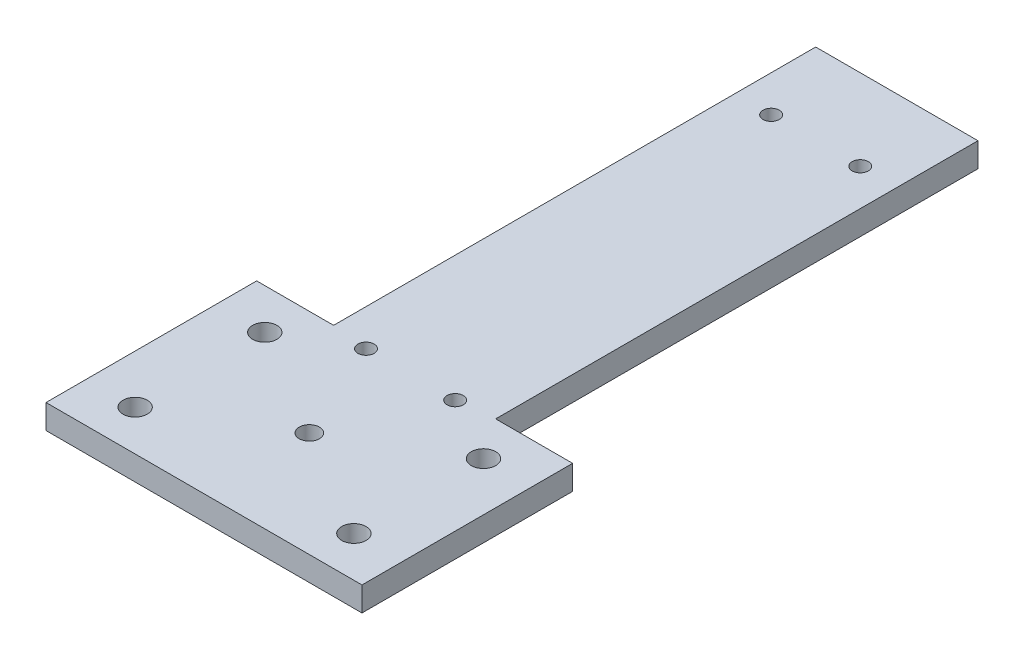
ISO-10303-21;
HEADER;
FILE_DESCRIPTION(('STEP AP214'),'2;1');
FILE_NAME('part.step','',(''),(''),'','','');
FILE_SCHEMA(('AUTOMOTIVE_DESIGN { 1 0 10303 214 1 1 1 1 }'));
ENDSEC;
DATA;
#1=APPLICATION_CONTEXT('core data for automotive mechanical design processes');
#2=APPLICATION_PROTOCOL_DEFINITION('international standard','automotive_design',2000,#1);
#3=PRODUCT_CONTEXT('',#1,'mechanical');
#4=PRODUCT('Part','Part','',(#3));
#5=PRODUCT_RELATED_PRODUCT_CATEGORY('part','',(#4));
#6=PRODUCT_DEFINITION_FORMATION('','',#4);
#7=PRODUCT_DEFINITION_CONTEXT('part definition',#1,'design');
#8=PRODUCT_DEFINITION('design','',#6,#7);
#9=PRODUCT_DEFINITION_SHAPE('','',#8);
#10=(LENGTH_UNIT() NAMED_UNIT(*) SI_UNIT(.MILLI.,.METRE.));
#11=(NAMED_UNIT(*) PLANE_ANGLE_UNIT() SI_UNIT($,.RADIAN.));
#12=(NAMED_UNIT(*) SI_UNIT($,.STERADIAN.) SOLID_ANGLE_UNIT());
#13=UNCERTAINTY_MEASURE_WITH_UNIT(LENGTH_MEASURE(1.E-05),#10,'distance_accuracy_value','');
#14=(GEOMETRIC_REPRESENTATION_CONTEXT(3) GLOBAL_UNCERTAINTY_ASSIGNED_CONTEXT((#13)) GLOBAL_UNIT_ASSIGNED_CONTEXT((#10,
#11,#12)) REPRESENTATION_CONTEXT('',''));
#15=CARTESIAN_POINT('',(0.,0.,0.));
#16=DIRECTION('',(0.,0.,1.));
#17=DIRECTION('',(1.,0.,0.));
#18=AXIS2_PLACEMENT_3D('',#15,#16,#17);
#19=CARTESIAN_POINT('',(0.000868295389407797,1186.43618290483,1920.91142558986));
#20=DIRECTION('',(-4.52022606479462E-07,0.,-0.999999999999898));
#21=DIRECTION('',(-0.999999999999898,0.,4.52022606479462E-07));
#22=AXIS2_PLACEMENT_3D('',#19,#20,#21);
#23=PLANE('',#22);
#24=DIRECTION('',(0.999999999999898,0.,-4.52022606479462E-07));
#25=VECTOR('',#24,1.);
#26=CARTESIAN_POINT('',(0.000868295389411396,1180.43618290483,1920.91142558986));
#27=LINE('',#26,#25);
#28=CARTESIAN_POINT('',(831.275007126595,1180.43618290483,1920.91104983515));
#29=VERTEX_POINT('',#28);
#30=CARTESIAN_POINT('',(850.275007126605,1180.43618290483,1920.91104124673));
#31=VERTEX_POINT('',#30);
#32=EDGE_CURVE('E155',#29,#31,#27,.T.);
#33=ORIENTED_EDGE('',*,*,#32,.F.);
#34=DIRECTION('',(0.,-1.,0.));
#35=VECTOR('',#34,1.);
#36=CARTESIAN_POINT('',(831.275007126595,1186.43618290483,1920.91104983515));
#37=LINE('',#36,#35);
#38=CARTESIAN_POINT('',(831.275007126595,1186.43618290483,1920.91104983515));
#39=VERTEX_POINT('',#38);
#40=EDGE_CURVE('E11',#39,#29,#37,.T.);
#41=ORIENTED_EDGE('',*,*,#40,.F.);
#42=DIRECTION('',(0.999999999999898,0.,-4.52022606479462E-07));
#43=VECTOR('',#42,1.);
#44=CARTESIAN_POINT('',(0.000868295389407797,1186.43618290483,1920.91142558986));
#45=LINE('',#44,#43);
#46=CARTESIAN_POINT('',(850.275007126605,1186.43618290483,1920.91104124673));
#47=VERTEX_POINT('',#46);
#48=EDGE_CURVE('E423',#39,#47,#45,.T.);
#49=ORIENTED_EDGE('',*,*,#48,.T.);
#50=DIRECTION('',(0.,-1.,0.));
#51=VECTOR('',#50,1.);
#52=CARTESIAN_POINT('',(850.275007126605,1186.43618290483,1920.91104124673));
#53=LINE('',#52,#51);
#54=EDGE_CURVE('E58',#47,#31,#53,.T.);
#55=ORIENTED_EDGE('',*,*,#54,.T.);
#56=EDGE_LOOP('',(#33,#41,#49,#55));
#57=FACE_BOUND('',#56,.T.);
#58=ADVANCED_FACE('F41',(#57),#23,.T.);
#59=CARTESIAN_POINT('',(832.333663807548,1186.43618290483,0.458827136420092));
#60=DIRECTION('',(-0.999999848059631,0.,-0.000551253765955834));
#61=DIRECTION('',(-0.000551253765955834,0.,0.999999848059631));
#62=AXIS2_PLACEMENT_3D('',#59,#60,#61);
#63=PLANE('',#62);
#64=DIRECTION('',(0.000551253765955834,0.,-0.999999848059631));
#65=VECTOR('',#64,1.);
#66=CARTESIAN_POINT('',(832.333663807548,1180.43618290483,0.458827136420092));
#67=LINE('',#66,#65);
#68=CARTESIAN_POINT('',(831.340606324744,1180.43618290483,1801.91106791605));
#69=VERTEX_POINT('',#68);
#70=EDGE_CURVE('E152',#29,#69,#67,.T.);
#71=ORIENTED_EDGE('',*,*,#70,.T.);
#72=DIRECTION('',(0.,-1.,0.));
#73=VECTOR('',#72,1.);
#74=CARTESIAN_POINT('',(831.340606324744,1186.43618290483,1801.91106791605));
#75=LINE('',#74,#73);
#76=CARTESIAN_POINT('',(831.340606324744,1186.43618290483,1801.91106791605));
#77=VERTEX_POINT('',#76);
#78=EDGE_CURVE('E50',#77,#69,#75,.T.);
#79=ORIENTED_EDGE('',*,*,#78,.F.);
#80=DIRECTION('',(0.000551253765955834,0.,-0.999999848059631));
#81=VECTOR('',#80,1.);
#82=CARTESIAN_POINT('',(832.333663807548,1186.43618290483,0.458827136420092));
#83=LINE('',#82,#81);
#84=EDGE_CURVE('E424',#39,#77,#83,.T.);
#85=ORIENTED_EDGE('',*,*,#84,.F.);
#86=ORIENTED_EDGE('',*,*,#40,.T.);
#87=EDGE_LOOP('',(#71,#79,#85,#86));
#88=FACE_BOUND('',#87,.T.);
#89=ADVANCED_FACE('F153',(#88),#63,.F.);
#90=CARTESIAN_POINT('',(9.98263917371704E-12,1186.43618290483,1801.91106791606));
#91=DIRECTION('',(0.,0.,-1.));
#92=DIRECTION('',(-1.,0.,0.));
#93=AXIS2_PLACEMENT_3D('',#90,#91,#92);
#94=PLANE('',#93);
#95=DIRECTION('',(1.,0.,0.));
#96=VECTOR('',#95,1.);
#97=CARTESIAN_POINT('',(9.9862385486062E-12,1180.43618290483,1801.91106791606));
#98=LINE('',#97,#96);
#99=CARTESIAN_POINT('',(791.275007126604,1180.43618290483,1801.91106791605));
#100=VERTEX_POINT('',#99);
#101=EDGE_CURVE('E147',#100,#69,#98,.T.);
#102=ORIENTED_EDGE('',*,*,#101,.F.);
#103=DIRECTION('',(0.,-1.,0.));
#104=VECTOR('',#103,1.);
#105=CARTESIAN_POINT('',(791.275007126604,1186.43618290483,1801.91106791605));
#106=LINE('',#105,#104);
#107=CARTESIAN_POINT('',(791.275007126604,1186.43618290483,1801.91106791605));
#108=VERTEX_POINT('',#107);
#109=EDGE_CURVE('E139',#108,#100,#106,.T.);
#110=ORIENTED_EDGE('',*,*,#109,.F.);
#111=DIRECTION('',(1.,0.,0.));
#112=VECTOR('',#111,1.);
#113=CARTESIAN_POINT('',(9.98263917371704E-12,1186.43618290483,1801.91106791606));
#114=LINE('',#113,#112);
#115=EDGE_CURVE('E149',#108,#77,#114,.T.);
#116=ORIENTED_EDGE('',*,*,#115,.T.);
#117=ORIENTED_EDGE('',*,*,#78,.T.);
#118=EDGE_LOOP('',(#102,#110,#116,#117));
#119=FACE_BOUND('',#118,.T.);
#120=ADVANCED_FACE('F145',(#119),#94,.T.);
#121=CARTESIAN_POINT('',(791.275007126606,1186.43618290483,7.3822834598517E-13));
#122=DIRECTION('',(1.,0.,0.));
#123=DIRECTION('',(0.,0.,-1.));
#124=AXIS2_PLACEMENT_3D('',#121,#122,#123);
#125=PLANE('',#124);
#126=DIRECTION('',(0.,0.,1.));
#127=VECTOR('',#126,1.);
#128=CARTESIAN_POINT('',(791.275007126606,1180.43618290483,7.3822834598517E-13));
#129=LINE('',#128,#127);
#130=CARTESIAN_POINT('',(791.275007126604,1180.43618290483,1920.91106791606));
#131=VERTEX_POINT('',#130);
#132=EDGE_CURVE('E162',#100,#131,#129,.T.);
#133=ORIENTED_EDGE('',*,*,#132,.T.);
#134=DIRECTION('',(0.,-1.,0.));
#135=VECTOR('',#134,1.);
#136=CARTESIAN_POINT('',(791.275007126604,1186.43618290483,1920.91106791606));
#137=LINE('',#136,#135);
#138=CARTESIAN_POINT('',(791.275007126604,1186.43618290483,1920.91106791606));
#139=VERTEX_POINT('',#138);
#140=EDGE_CURVE('E133',#139,#131,#137,.T.);
#141=ORIENTED_EDGE('',*,*,#140,.F.);
#142=DIRECTION('',(0.,0.,1.));
#143=VECTOR('',#142,1.);
#144=CARTESIAN_POINT('',(791.275007126606,1186.43618290483,7.3822834598517E-13));
#145=LINE('',#144,#143);
#146=EDGE_CURVE('E419',#108,#139,#145,.T.);
#147=ORIENTED_EDGE('',*,*,#146,.F.);
#148=ORIENTED_EDGE('',*,*,#109,.T.);
#149=EDGE_LOOP('',(#133,#141,#147,#148));
#150=FACE_BOUND('',#149,.T.);
#151=ADVANCED_FACE('F380',(#150),#125,.F.);
#152=CARTESIAN_POINT('',(0.,1186.43618290483,1920.91106791606));
#153=DIRECTION('',(0.,0.,-1.));
#154=DIRECTION('',(0.,1.,0.));
#155=AXIS2_PLACEMENT_3D('',#152,#153,#154);
#156=PLANE('',#155);
#157=DIRECTION('',(1.,0.,0.));
#158=VECTOR('',#157,1.);
#159=CARTESIAN_POINT('',(0.,1180.43618290483,1920.91106791606));
#160=LINE('',#159,#158);
#161=CARTESIAN_POINT('',(772.275007126593,1180.43618290483,1920.91106791606));
#162=VERTEX_POINT('',#161);
#163=EDGE_CURVE('E164',#162,#131,#160,.T.);
#164=ORIENTED_EDGE('',*,*,#163,.F.);
#165=DIRECTION('',(0.,-1.,0.));
#166=VECTOR('',#165,1.);
#167=CARTESIAN_POINT('',(772.275007126593,1186.43618290483,1920.91106791606));
#168=LINE('',#167,#166);
#169=CARTESIAN_POINT('',(772.275007126593,1186.43618290483,1920.91106791606));
#170=VERTEX_POINT('',#169);
#171=EDGE_CURVE('E131',#170,#162,#168,.T.);
#172=ORIENTED_EDGE('',*,*,#171,.F.);
#173=DIRECTION('',(1.,0.,0.));
#174=VECTOR('',#173,1.);
#175=CARTESIAN_POINT('',(0.,1186.43618290483,1920.91106791606));
#176=LINE('',#175,#174);
#177=EDGE_CURVE('E125',#170,#139,#176,.T.);
#178=ORIENTED_EDGE('',*,*,#177,.T.);
#179=ORIENTED_EDGE('',*,*,#140,.T.);
#180=EDGE_LOOP('',(#164,#172,#178,#179));
#181=FACE_BOUND('',#180,.T.);
#182=ADVANCED_FACE('F372',(#181),#156,.T.);
#183=CARTESIAN_POINT('',(772.275007126593,1186.43618290483,0.));
#184=DIRECTION('',(1.,0.,0.));
#185=DIRECTION('',(0.,1.,0.));
#186=AXIS2_PLACEMENT_3D('',#183,#184,#185);
#187=PLANE('',#186);
#188=DIRECTION('',(0.,0.,1.));
#189=VECTOR('',#188,1.);
#190=CARTESIAN_POINT('',(772.275007126593,1180.43618290483,0.));
#191=LINE('',#190,#189);
#192=CARTESIAN_POINT('',(772.275007126593,1180.43618290483,1972.91106791605));
#193=VERTEX_POINT('',#192);
#194=EDGE_CURVE('E130',#162,#193,#191,.T.);
#195=ORIENTED_EDGE('',*,*,#194,.T.);
#196=DIRECTION('',(0.,-1.,0.));
#197=VECTOR('',#196,1.);
#198=CARTESIAN_POINT('',(772.275007126593,1186.43618290483,1972.91106791605));
#199=LINE('',#198,#197);
#200=CARTESIAN_POINT('',(772.275007126593,1186.43618290483,1972.91106791605));
#201=VERTEX_POINT('',#200);
#202=EDGE_CURVE('E112',#201,#193,#199,.T.);
#203=ORIENTED_EDGE('',*,*,#202,.F.);
#204=DIRECTION('',(0.,0.,1.));
#205=VECTOR('',#204,1.);
#206=CARTESIAN_POINT('',(772.275007126593,1186.43618290483,0.));
#207=LINE('',#206,#205);
#208=EDGE_CURVE('E117',#170,#201,#207,.T.);
#209=ORIENTED_EDGE('',*,*,#208,.F.);
#210=ORIENTED_EDGE('',*,*,#171,.T.);
#211=EDGE_LOOP('',(#195,#203,#209,#210));
#212=FACE_BOUND('',#211,.T.);
#213=ADVANCED_FACE('F128',(#212),#187,.F.);
#214=CARTESIAN_POINT('',(0.,1186.43618290483,1972.91106791605));
#215=DIRECTION('',(0.,0.,-1.));
#216=DIRECTION('',(0.,1.,0.));
#217=AXIS2_PLACEMENT_3D('',#214,#215,#216);
#218=PLANE('',#217);
#219=DIRECTION('',(1.,0.,0.));
#220=VECTOR('',#219,1.);
#221=CARTESIAN_POINT('',(0.,1180.43618290483,1972.91106791605));
#222=LINE('',#221,#220);
#223=CARTESIAN_POINT('',(850.275007126618,1180.43618290483,1972.91106791605));
#224=VERTEX_POINT('',#223);
#225=EDGE_CURVE('E170',#193,#224,#222,.T.);
#226=ORIENTED_EDGE('',*,*,#225,.T.);
#227=DIRECTION('',(0.,-1.,0.));
#228=VECTOR('',#227,1.);
#229=CARTESIAN_POINT('',(850.275007126618,1186.43618290483,1972.91106791605));
#230=LINE('',#229,#228);
#231=CARTESIAN_POINT('',(850.275007126618,1186.43618290483,1972.91106791605));
#232=VERTEX_POINT('',#231);
#233=EDGE_CURVE('E84',#232,#224,#230,.T.);
#234=ORIENTED_EDGE('',*,*,#233,.F.);
#235=DIRECTION('',(1.,0.,0.));
#236=VECTOR('',#235,1.);
#237=CARTESIAN_POINT('',(0.,1186.43618290483,1972.91106791605));
#238=LINE('',#237,#236);
#239=EDGE_CURVE('E108',#201,#232,#238,.T.);
#240=ORIENTED_EDGE('',*,*,#239,.F.);
#241=ORIENTED_EDGE('',*,*,#202,.T.);
#242=EDGE_LOOP('',(#226,#234,#240,#241));
#243=FACE_BOUND('',#242,.T.);
#244=ADVANCED_FACE('F110',(#243),#218,.F.);
#245=CARTESIAN_POINT('',(800.275007126605,1186.43618290483,1921.91106791605));
#246=DIRECTION('',(0.,-1.,0.));
#247=DIRECTION('',(1.,0.,0.));
#248=AXIS2_PLACEMENT_3D('',#245,#246,#247);
#249=CYLINDRICAL_SURFACE('',#248,2.);
#250=CARTESIAN_POINT('',(800.275007126605,1186.43618290483,1921.91106791605));
#251=DIRECTION('',(0.,1.,0.));
#252=DIRECTION('',(0.,0.,1.));
#253=AXIS2_PLACEMENT_3D('',#250,#251,#252);
#254=CIRCLE('',#253,2.);
#255=CARTESIAN_POINT('',(800.275007126605,1186.43618290483,1923.91106791605));
#256=VERTEX_POINT('',#255);
#257=EDGE_CURVE('E183',#256,#256,#254,.F.);
#258=ORIENTED_EDGE('',*,*,#257,.F.);
#259=EDGE_LOOP('',(#258));
#260=FACE_BOUND('',#259,.T.);
#261=CARTESIAN_POINT('',(800.275007126605,1180.43618290483,1921.91106791605));
#262=DIRECTION('',(0.,1.,0.));
#263=DIRECTION('',(0.,0.,1.));
#264=AXIS2_PLACEMENT_3D('',#261,#262,#263);
#265=CIRCLE('',#264,2.);
#266=CARTESIAN_POINT('',(800.275007126605,1180.43618290483,1923.91106791605));
#267=VERTEX_POINT('',#266);
#268=EDGE_CURVE('E175',#267,#267,#265,.F.);
#269=ORIENTED_EDGE('',*,*,#268,.T.);
#270=EDGE_LOOP('',(#269));
#271=FACE_BOUND('',#270,.T.);
#272=ADVANCED_FACE('F214',(#260,#271),#249,.F.);
#273=CARTESIAN_POINT('',(850.275007126138,1186.43618290483,-2.06952619782814E-10));
#274=DIRECTION('',(1.,0.,-2.4339492287595E-13));
#275=DIRECTION('',(-2.4339492287595E-13,0.,-1.));
#276=AXIS2_PLACEMENT_3D('',#273,#274,#275);
#277=PLANE('',#276);
#278=DIRECTION('',(2.4339492287595E-13,0.,1.));
#279=VECTOR('',#278,1.);
#280=CARTESIAN_POINT('',(850.275007126138,1180.43618290483,-2.06952619782814E-10));
#281=LINE('',#280,#279);
#282=EDGE_CURVE('E172',#31,#224,#281,.T.);
#283=ORIENTED_EDGE('',*,*,#282,.F.);
#284=ORIENTED_EDGE('',*,*,#54,.F.);
#285=DIRECTION('',(2.4339492287595E-13,0.,1.));
#286=VECTOR('',#285,1.);
#287=CARTESIAN_POINT('',(850.275007126138,1186.43618290483,-2.06952619782814E-10));
#288=LINE('',#287,#286);
#289=EDGE_CURVE('E116',#47,#232,#288,.T.);
#290=ORIENTED_EDGE('',*,*,#289,.T.);
#291=ORIENTED_EDGE('',*,*,#233,.T.);
#292=EDGE_LOOP('',(#283,#284,#290,#291));
#293=FACE_BOUND('',#292,.T.);
#294=ADVANCED_FACE('F211',(#293),#277,.T.);
#295=CARTESIAN_POINT('',(811.275007126618,1186.43618290483,1946.91106791605));
#296=DIRECTION('',(0.,-1.,0.));
#297=DIRECTION('',(1.,0.,0.));
#298=AXIS2_PLACEMENT_3D('',#295,#296,#297);
#299=CYLINDRICAL_SURFACE('',#298,2.49999999999967);
#300=CARTESIAN_POINT('',(811.275007126618,1186.43618290483,1946.91106791605));
#301=DIRECTION('',(0.,1.,0.));
#302=DIRECTION('',(0.,0.,1.));
#303=AXIS2_PLACEMENT_3D('',#300,#301,#302);
#304=CIRCLE('',#303,2.49999999999967);
#305=CARTESIAN_POINT('',(811.275007126618,1186.43618290483,1949.41106791605));
#306=VERTEX_POINT('',#305);
#307=EDGE_CURVE('E425',#306,#306,#304,.T.);
#308=ORIENTED_EDGE('',*,*,#307,.T.);
#309=EDGE_LOOP('',(#308));
#310=FACE_BOUND('',#309,.T.);
#311=CARTESIAN_POINT('',(811.275007126618,1180.43618290483,1946.91106791605));
#312=DIRECTION('',(0.,1.,0.));
#313=DIRECTION('',(0.,0.,1.));
#314=AXIS2_PLACEMENT_3D('',#311,#312,#313);
#315=CIRCLE('',#314,2.49999999999967);
#316=CARTESIAN_POINT('',(811.275007126618,1180.43618290483,1949.41106791605));
#317=VERTEX_POINT('',#316);
#318=EDGE_CURVE('E209',#317,#317,#315,.T.);
#319=ORIENTED_EDGE('',*,*,#318,.F.);
#320=EDGE_LOOP('',(#319));
#321=FACE_BOUND('',#320,.T.);
#322=ADVANCED_FACE('F213',(#310,#321),#299,.F.);
#323=CARTESIAN_POINT('',(784.275007126606,1186.43618290483,1930.91106791606));
#324=DIRECTION('',(0.,-1.,0.));
#325=DIRECTION('',(1.,0.,0.));
#326=AXIS2_PLACEMENT_3D('',#323,#324,#325);
#327=CYLINDRICAL_SURFACE('',#326,2.99999999998754);
#328=CARTESIAN_POINT('',(784.275007126606,1186.43618290483,1930.91106791606));
#329=DIRECTION('',(0.,1.,0.));
#330=DIRECTION('',(0.,0.,1.));
#331=AXIS2_PLACEMENT_3D('',#328,#329,#330);
#332=CIRCLE('',#331,2.99999999998754);
#333=CARTESIAN_POINT('',(784.275007126606,1186.43618290483,1933.91106791605));
#334=VERTEX_POINT('',#333);
#335=EDGE_CURVE('E429',#334,#334,#332,.T.);
#336=ORIENTED_EDGE('',*,*,#335,.T.);
#337=EDGE_LOOP('',(#336));
#338=FACE_BOUND('',#337,.T.);
#339=CARTESIAN_POINT('',(784.275007126606,1180.43618290483,1930.91106791606));
#340=DIRECTION('',(0.,1.,0.));
#341=DIRECTION('',(0.,0.,1.));
#342=AXIS2_PLACEMENT_3D('',#339,#340,#341);
#343=CIRCLE('',#342,2.99999999998754);
#344=CARTESIAN_POINT('',(784.275007126606,1180.43618290483,1933.91106791605));
#345=VERTEX_POINT('',#344);
#346=EDGE_CURVE('E206',#345,#345,#343,.T.);
#347=ORIENTED_EDGE('',*,*,#346,.F.);
#348=EDGE_LOOP('',(#347));
#349=FACE_BOUND('',#348,.T.);
#350=ADVANCED_FACE('F220',(#338,#349),#327,.F.);
#351=CARTESIAN_POINT('',(784.275007126606,1186.43618290483,1962.91106791606));
#352=DIRECTION('',(0.,-1.,0.));
#353=DIRECTION('',(1.,0.,0.));
#354=AXIS2_PLACEMENT_3D('',#351,#352,#353);
#355=CYLINDRICAL_SURFACE('',#354,2.99999999998754);
#356=CARTESIAN_POINT('',(784.275007126606,1186.43618290483,1962.91106791606));
#357=DIRECTION('',(0.,1.,0.));
#358=DIRECTION('',(0.,0.,1.));
#359=AXIS2_PLACEMENT_3D('',#356,#357,#358);
#360=CIRCLE('',#359,2.99999999998754);
#361=CARTESIAN_POINT('',(784.275007126606,1186.43618290483,1965.91106791605));
#362=VERTEX_POINT('',#361);
#363=EDGE_CURVE('E434',#362,#362,#360,.T.);
#364=ORIENTED_EDGE('',*,*,#363,.T.);
#365=EDGE_LOOP('',(#364));
#366=FACE_BOUND('',#365,.T.);
#367=CARTESIAN_POINT('',(784.275007126606,1180.43618290483,1962.91106791606));
#368=DIRECTION('',(0.,1.,0.));
#369=DIRECTION('',(0.,0.,1.));
#370=AXIS2_PLACEMENT_3D('',#367,#368,#369);
#371=CIRCLE('',#370,2.99999999998754);
#372=CARTESIAN_POINT('',(784.275007126606,1180.43618290483,1965.91106791605));
#373=VERTEX_POINT('',#372);
#374=EDGE_CURVE('E203',#373,#373,#371,.T.);
#375=ORIENTED_EDGE('',*,*,#374,.F.);
#376=EDGE_LOOP('',(#375));
#377=FACE_BOUND('',#376,.T.);
#378=ADVANCED_FACE('F236',(#366,#377),#355,.F.);
#379=CARTESIAN_POINT('',(838.275007126605,1186.43618290483,1930.91106791608));
#380=DIRECTION('',(0.,-1.,0.));
#381=DIRECTION('',(1.,0.,0.));
#382=AXIS2_PLACEMENT_3D('',#379,#380,#381);
#383=CYLINDRICAL_SURFACE('',#382,3.00000000002243);
#384=CARTESIAN_POINT('',(838.275007126605,1186.43618290483,1930.91106791608));
#385=DIRECTION('',(0.,1.,0.));
#386=DIRECTION('',(0.,0.,1.));
#387=AXIS2_PLACEMENT_3D('',#384,#385,#386);
#388=CIRCLE('',#387,3.00000000002243);
#389=CARTESIAN_POINT('',(838.275007126605,1186.43618290483,1933.9110679161));
#390=VERTEX_POINT('',#389);
#391=EDGE_CURVE('E437',#390,#390,#388,.T.);
#392=ORIENTED_EDGE('',*,*,#391,.T.);
#393=EDGE_LOOP('',(#392));
#394=FACE_BOUND('',#393,.T.);
#395=CARTESIAN_POINT('',(838.275007126605,1180.43618290483,1930.91106791608));
#396=DIRECTION('',(0.,1.,0.));
#397=DIRECTION('',(0.,0.,1.));
#398=AXIS2_PLACEMENT_3D('',#395,#396,#397);
#399=CIRCLE('',#398,3.00000000002243);
#400=CARTESIAN_POINT('',(838.275007126605,1180.43618290483,1933.9110679161));
#401=VERTEX_POINT('',#400);
#402=EDGE_CURVE('E200',#401,#401,#399,.T.);
#403=ORIENTED_EDGE('',*,*,#402,.F.);
#404=EDGE_LOOP('',(#403));
#405=FACE_BOUND('',#404,.T.);
#406=ADVANCED_FACE('F240',(#394,#405),#383,.F.);
#407=CARTESIAN_POINT('',(838.275007126606,1186.43618290483,1962.91106791608));
#408=DIRECTION('',(0.,-1.,0.));
#409=DIRECTION('',(1.,0.,0.));
#410=AXIS2_PLACEMENT_3D('',#407,#408,#409);
#411=CYLINDRICAL_SURFACE('',#410,3.00000000002243);
#412=CARTESIAN_POINT('',(838.275007126606,1186.43618290483,1962.91106791608));
#413=DIRECTION('',(0.,1.,0.));
#414=DIRECTION('',(0.,0.,1.));
#415=AXIS2_PLACEMENT_3D('',#412,#413,#414);
#416=CIRCLE('',#415,3.00000000002243);
#417=CARTESIAN_POINT('',(838.275007126606,1186.43618290483,1965.9110679161));
#418=VERTEX_POINT('',#417);
#419=EDGE_CURVE('E440',#418,#418,#416,.T.);
#420=ORIENTED_EDGE('',*,*,#419,.T.);
#421=EDGE_LOOP('',(#420));
#422=FACE_BOUND('',#421,.T.);
#423=CARTESIAN_POINT('',(838.275007126606,1180.43618290483,1962.91106791608));
#424=DIRECTION('',(0.,1.,0.));
#425=DIRECTION('',(0.,0.,1.));
#426=AXIS2_PLACEMENT_3D('',#423,#424,#425);
#427=CIRCLE('',#426,3.00000000002243);
#428=CARTESIAN_POINT('',(838.275007126606,1180.43618290483,1965.9110679161));
#429=VERTEX_POINT('',#428);
#430=EDGE_CURVE('E197',#429,#429,#427,.T.);
#431=ORIENTED_EDGE('',*,*,#430,.F.);
#432=EDGE_LOOP('',(#431));
#433=FACE_BOUND('',#432,.T.);
#434=ADVANCED_FACE('F244',(#422,#433),#411,.F.);
#435=CARTESIAN_POINT('',(822.275007126605,1186.43618290483,1921.91106791605));
#436=DIRECTION('',(0.,-1.,0.));
#437=DIRECTION('',(1.,0.,0.));
#438=AXIS2_PLACEMENT_3D('',#435,#436,#437);
#439=CYLINDRICAL_SURFACE('',#438,2.);
#440=CARTESIAN_POINT('',(822.275007126605,1186.43618290483,1921.91106791605));
#441=DIRECTION('',(0.,1.,0.));
#442=DIRECTION('',(0.,0.,1.));
#443=AXIS2_PLACEMENT_3D('',#440,#441,#442);
#444=CIRCLE('',#443,2.);
#445=CARTESIAN_POINT('',(822.275007126605,1186.43618290483,1923.91106791605));
#446=VERTEX_POINT('',#445);
#447=EDGE_CURVE('E259',#446,#446,#444,.T.);
#448=ORIENTED_EDGE('',*,*,#447,.T.);
#449=EDGE_LOOP('',(#448));
#450=FACE_BOUND('',#449,.T.);
#451=CARTESIAN_POINT('',(822.275007126605,1180.43618290483,1921.91106791605));
#452=DIRECTION('',(0.,1.,0.));
#453=DIRECTION('',(0.,0.,1.));
#454=AXIS2_PLACEMENT_3D('',#451,#452,#453);
#455=CIRCLE('',#454,2.);
#456=CARTESIAN_POINT('',(822.275007126605,1180.43618290483,1923.91106791605));
#457=VERTEX_POINT('',#456);
#458=EDGE_CURVE('E194',#457,#457,#455,.T.);
#459=ORIENTED_EDGE('',*,*,#458,.F.);
#460=EDGE_LOOP('',(#459));
#461=FACE_BOUND('',#460,.T.);
#462=ADVANCED_FACE('F247',(#450,#461),#439,.F.);
#463=CARTESIAN_POINT('',(822.275007126606,1186.43618290483,1821.91106791605));
#464=DIRECTION('',(0.,-1.,0.));
#465=DIRECTION('',(1.,0.,0.));
#466=AXIS2_PLACEMENT_3D('',#463,#464,#465);
#467=CYLINDRICAL_SURFACE('',#466,2.);
#468=CARTESIAN_POINT('',(822.275007126606,1186.43618290483,1821.91106791605));
#469=DIRECTION('',(0.,1.,0.));
#470=DIRECTION('',(0.,0.,1.));
#471=AXIS2_PLACEMENT_3D('',#468,#469,#470);
#472=CIRCLE('',#471,2.);
#473=CARTESIAN_POINT('',(822.275007126606,1186.43618290483,1823.91106791605));
#474=VERTEX_POINT('',#473);
#475=EDGE_CURVE('E180',#474,#474,#472,.T.);
#476=ORIENTED_EDGE('',*,*,#475,.T.);
#477=EDGE_LOOP('',(#476));
#478=FACE_BOUND('',#477,.T.);
#479=CARTESIAN_POINT('',(822.275007126606,1180.43618290483,1821.91106791605));
#480=DIRECTION('',(0.,1.,0.));
#481=DIRECTION('',(0.,0.,1.));
#482=AXIS2_PLACEMENT_3D('',#479,#480,#481);
#483=CIRCLE('',#482,2.);
#484=CARTESIAN_POINT('',(822.275007126606,1180.43618290483,1823.91106791605));
#485=VERTEX_POINT('',#484);
#486=EDGE_CURVE('E191',#485,#485,#483,.T.);
#487=ORIENTED_EDGE('',*,*,#486,.F.);
#488=EDGE_LOOP('',(#487));
#489=FACE_BOUND('',#488,.T.);
#490=ADVANCED_FACE('F43',(#478,#489),#467,.F.);
#491=CARTESIAN_POINT('',(800.275007126606,1186.43618290483,1821.91106791605));
#492=DIRECTION('',(0.,-1.,0.));
#493=DIRECTION('',(1.,0.,0.));
#494=AXIS2_PLACEMENT_3D('',#491,#492,#493);
#495=CYLINDRICAL_SURFACE('',#494,2.);
#496=CARTESIAN_POINT('',(800.275007126606,1186.43618290483,1821.91106791605));
#497=DIRECTION('',(0.,1.,0.));
#498=DIRECTION('',(0.,0.,1.));
#499=AXIS2_PLACEMENT_3D('',#496,#497,#498);
#500=CIRCLE('',#499,2.);
#501=CARTESIAN_POINT('',(800.275007126606,1186.43618290483,1823.91106791605));
#502=VERTEX_POINT('',#501);
#503=EDGE_CURVE('E181',#502,#502,#500,.F.);
#504=ORIENTED_EDGE('',*,*,#503,.F.);
#505=EDGE_LOOP('',(#504));
#506=FACE_BOUND('',#505,.T.);
#507=CARTESIAN_POINT('',(800.275007126606,1180.43618290483,1821.91106791605));
#508=DIRECTION('',(0.,1.,0.));
#509=DIRECTION('',(0.,0.,1.));
#510=AXIS2_PLACEMENT_3D('',#507,#508,#509);
#511=CIRCLE('',#510,2.);
#512=CARTESIAN_POINT('',(800.275007126606,1180.43618290483,1823.91106791605));
#513=VERTEX_POINT('',#512);
#514=EDGE_CURVE('E178',#513,#513,#511,.F.);
#515=ORIENTED_EDGE('',*,*,#514,.T.);
#516=EDGE_LOOP('',(#515));
#517=FACE_BOUND('',#516,.T.);
#518=ADVANCED_FACE('F254',(#506,#517),#495,.F.);
#519=CARTESIAN_POINT('',(0.,1186.43618290483,0.));
#520=DIRECTION('',(0.,1.,0.));
#521=DIRECTION('',(0.,0.,1.));
#522=AXIS2_PLACEMENT_3D('',#519,#520,#521);
#523=PLANE('',#522);
#524=ORIENTED_EDGE('',*,*,#475,.F.);
#525=EDGE_LOOP('',(#524));
#526=FACE_BOUND('',#525,.T.);
#527=ORIENTED_EDGE('',*,*,#447,.F.);
#528=EDGE_LOOP('',(#527));
#529=FACE_BOUND('',#528,.T.);
#530=ORIENTED_EDGE('',*,*,#419,.F.);
#531=EDGE_LOOP('',(#530));
#532=FACE_BOUND('',#531,.T.);
#533=ORIENTED_EDGE('',*,*,#391,.F.);
#534=EDGE_LOOP('',(#533));
#535=FACE_BOUND('',#534,.T.);
#536=ORIENTED_EDGE('',*,*,#363,.F.);
#537=EDGE_LOOP('',(#536));
#538=FACE_BOUND('',#537,.T.);
#539=ORIENTED_EDGE('',*,*,#335,.F.);
#540=EDGE_LOOP('',(#539));
#541=FACE_BOUND('',#540,.T.);
#542=ORIENTED_EDGE('',*,*,#307,.F.);
#543=EDGE_LOOP('',(#542));
#544=FACE_BOUND('',#543,.T.);
#545=ORIENTED_EDGE('',*,*,#48,.F.);
#546=ORIENTED_EDGE('',*,*,#84,.T.);
#547=ORIENTED_EDGE('',*,*,#115,.F.);
#548=ORIENTED_EDGE('',*,*,#146,.T.);
#549=ORIENTED_EDGE('',*,*,#177,.F.);
#550=ORIENTED_EDGE('',*,*,#208,.T.);
#551=ORIENTED_EDGE('',*,*,#239,.T.);
#552=ORIENTED_EDGE('',*,*,#289,.F.);
#553=EDGE_LOOP('',(#545,#546,#547,#548,#549,#550,#551,#552));
#554=FACE_BOUND('',#553,.T.);
#555=ORIENTED_EDGE('',*,*,#257,.T.);
#556=EDGE_LOOP('',(#555));
#557=FACE_BOUND('',#556,.T.);
#558=ORIENTED_EDGE('',*,*,#503,.T.);
#559=EDGE_LOOP('',(#558));
#560=FACE_BOUND('',#559,.T.);
#561=ADVANCED_FACE('F122',(#526,#529,#532,#535,#538,#541,#544,#554,#557,#560),#523,.T.);
#562=CARTESIAN_POINT('',(0.,1180.43618290483,0.));
#563=DIRECTION('',(0.,1.,0.));
#564=DIRECTION('',(0.,0.,1.));
#565=AXIS2_PLACEMENT_3D('',#562,#563,#564);
#566=PLANE('',#565);
#567=ORIENTED_EDGE('',*,*,#486,.T.);
#568=EDGE_LOOP('',(#567));
#569=FACE_BOUND('',#568,.T.);
#570=ORIENTED_EDGE('',*,*,#458,.T.);
#571=EDGE_LOOP('',(#570));
#572=FACE_BOUND('',#571,.T.);
#573=ORIENTED_EDGE('',*,*,#430,.T.);
#574=EDGE_LOOP('',(#573));
#575=FACE_BOUND('',#574,.T.);
#576=ORIENTED_EDGE('',*,*,#402,.T.);
#577=EDGE_LOOP('',(#576));
#578=FACE_BOUND('',#577,.T.);
#579=ORIENTED_EDGE('',*,*,#374,.T.);
#580=EDGE_LOOP('',(#579));
#581=FACE_BOUND('',#580,.T.);
#582=ORIENTED_EDGE('',*,*,#346,.T.);
#583=EDGE_LOOP('',(#582));
#584=FACE_BOUND('',#583,.T.);
#585=ORIENTED_EDGE('',*,*,#318,.T.);
#586=EDGE_LOOP('',(#585));
#587=FACE_BOUND('',#586,.T.);
#588=ORIENTED_EDGE('',*,*,#32,.T.);
#589=ORIENTED_EDGE('',*,*,#282,.T.);
#590=ORIENTED_EDGE('',*,*,#225,.F.);
#591=ORIENTED_EDGE('',*,*,#194,.F.);
#592=ORIENTED_EDGE('',*,*,#163,.T.);
#593=ORIENTED_EDGE('',*,*,#132,.F.);
#594=ORIENTED_EDGE('',*,*,#101,.T.);
#595=ORIENTED_EDGE('',*,*,#70,.F.);
#596=EDGE_LOOP('',(#588,#589,#590,#591,#592,#593,#594,#595));
#597=FACE_BOUND('',#596,.T.);
#598=ORIENTED_EDGE('',*,*,#268,.F.);
#599=EDGE_LOOP('',(#598));
#600=FACE_BOUND('',#599,.T.);
#601=ORIENTED_EDGE('',*,*,#514,.F.);
#602=EDGE_LOOP('',(#601));
#603=FACE_BOUND('',#602,.T.);
#604=ADVANCED_FACE('F158',(#569,#572,#575,#578,#581,#584,#587,#597,#600,#603),#566,.F.);
#605=CLOSED_SHELL('',(#58,#89,#120,#151,#182,#213,#244,#272,#294,#322,#350,#378,#406,#434,#462,
#490,#518,#561,#604));
#606=MANIFOLD_SOLID_BREP('B2',#605);
#607=ADVANCED_BREP_SHAPE_REPRESENTATION('',(#18,#606),#14);
#608=SHAPE_DEFINITION_REPRESENTATION(#9,#607);
ENDSEC;
END-ISO-10303-21;
